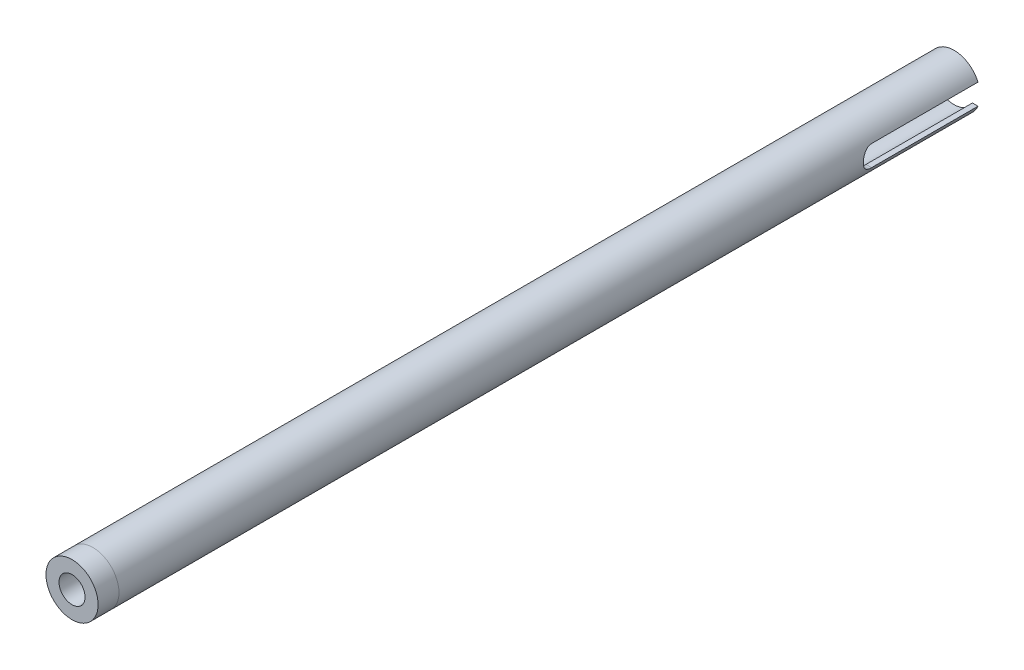
ISO-10303-21;
HEADER;
FILE_DESCRIPTION(('STEP AP214'),'2;1');
FILE_NAME('part.step','',(''),(''),'','','');
FILE_SCHEMA(('AUTOMOTIVE_DESIGN { 1 0 10303 214 1 1 1 1 }'));
ENDSEC;
DATA;
#1=APPLICATION_CONTEXT('core data for automotive mechanical design processes');
#2=APPLICATION_PROTOCOL_DEFINITION('international standard','automotive_design',2000,#1);
#3=PRODUCT_CONTEXT('',#1,'mechanical');
#4=PRODUCT('Part','Part','',(#3));
#5=PRODUCT_RELATED_PRODUCT_CATEGORY('part','',(#4));
#6=PRODUCT_DEFINITION_FORMATION('','',#4);
#7=PRODUCT_DEFINITION_CONTEXT('part definition',#1,'design');
#8=PRODUCT_DEFINITION('design','',#6,#7);
#9=PRODUCT_DEFINITION_SHAPE('','',#8);
#10=(LENGTH_UNIT() NAMED_UNIT(*) SI_UNIT(.MILLI.,.METRE.));
#11=(NAMED_UNIT(*) PLANE_ANGLE_UNIT() SI_UNIT($,.RADIAN.));
#12=(NAMED_UNIT(*) SI_UNIT($,.STERADIAN.) SOLID_ANGLE_UNIT());
#13=UNCERTAINTY_MEASURE_WITH_UNIT(LENGTH_MEASURE(1.E-05),#10,'distance_accuracy_value','');
#14=(GEOMETRIC_REPRESENTATION_CONTEXT(3) GLOBAL_UNCERTAINTY_ASSIGNED_CONTEXT((#13)) GLOBAL_UNIT_ASSIGNED_CONTEXT((#10,
#11,#12)) REPRESENTATION_CONTEXT('',''));
#15=CARTESIAN_POINT('',(0.,0.,0.));
#16=DIRECTION('',(0.,0.,1.));
#17=DIRECTION('',(1.,0.,0.));
#18=AXIS2_PLACEMENT_3D('',#15,#16,#17);
#19=CARTESIAN_POINT('',(0.,0.,-268.498498783583));
#20=DIRECTION('',(0.,0.,1.));
#21=DIRECTION('',(1.,0.,0.));
#22=AXIS2_PLACEMENT_3D('',#19,#20,#21);
#23=CYLINDRICAL_SURFACE('',#22,7.9375);
#24=CARTESIAN_POINT('',(0.,0.,-6.35));
#25=DIRECTION('',(0.,0.,1.));
#26=DIRECTION('',(1.,0.,0.));
#27=AXIS2_PLACEMENT_3D('',#24,#25,#26);
#28=CIRCLE('',#27,7.9375);
#29=CARTESIAN_POINT('',(7.9375,0.,-6.35));
#30=VERTEX_POINT('',#29);
#31=EDGE_CURVE('E167',#30,#30,#28,.T.);
#32=ORIENTED_EDGE('',*,*,#31,.F.);
#33=EDGE_LOOP('',(#32));
#34=FACE_BOUND('',#33,.T.);
#35=CARTESIAN_POINT('',(-7.2748389157424,3.175,-236.113498783583));
#36=CARTESIAN_POINT('',(-7.27482137043434,3.17501267173453,-236.028078668101));
#37=CARTESIAN_POINT('',(-7.27634297592672,3.17155313247793,-235.942668138538));
#38=CARTESIAN_POINT('',(-7.28233338484875,3.15778866907725,-235.77253613421));
#39=CARTESIAN_POINT('',(-7.28680106535325,3.14748635311323,-235.687814409351));
#40=CARTESIAN_POINT('',(-7.29852916312671,3.12019002880163,-235.520000709542));
#41=CARTESIAN_POINT('',(-7.30577831906487,3.10322299732752,-235.436903564783));
#42=CARTESIAN_POINT('',(-7.32282161153745,3.06278779397034,-235.272592462757));
#43=CARTESIAN_POINT('',(-7.33261590324725,3.03931922568673,-235.191378620644));
#44=CARTESIAN_POINT('',(-7.36535331460444,2.9595292434296,-234.951553798061));
#45=CARTESIAN_POINT('',(-7.3916759567784,2.89376893609236,-234.796428869258));
#46=CARTESIAN_POINT('',(-7.45033259991548,2.73920602658921,-234.499341442546));
#47=CARTESIAN_POINT('',(-7.48267254395243,2.65038060922871,-234.357392167329));
#48=CARTESIAN_POINT('',(-7.55175295441386,2.44684429809695,-234.082671397809));
#49=CARTESIAN_POINT('',(-7.58863404630154,2.33103943595689,-233.950744013297));
#50=CARTESIAN_POINT('',(-7.66147718953598,2.07914562663536,-233.707581129665));
#51=CARTESIAN_POINT('',(-7.69743902899202,1.94305205135847,-233.596350364738));
#52=CARTESIAN_POINT('',(-7.76611692840652,1.64778282664418,-233.393429165242));
#53=CARTESIAN_POINT('',(-7.79864638434713,1.48790317306355,-233.302694753838));
#54=CARTESIAN_POINT('',(-7.85502980346525,1.15369615984562,-233.149837200421));
#55=CARTESIAN_POINT('',(-7.87889360585224,0.979385463602713,-233.087681587803));
#56=CARTESIAN_POINT('',(-7.91022225039827,0.670405323433344,-233.007169944147));
#57=CARTESIAN_POINT('',(-7.92038443902171,0.537888188660429,-232.981492020738));
#58=CARTESIAN_POINT('',(-7.93061686811603,0.337231082382099,-232.955736937656));
#59=CARTESIAN_POINT('',(-7.93319257341971,0.269991647180292,-232.949278840376));
#60=CARTESIAN_POINT('',(-7.93663621925193,0.135173873369592,-232.940657822624));
#61=CARTESIAN_POINT('',(-7.93750363389236,0.067595436817584,-232.938496224806));
#62=CARTESIAN_POINT('',(-7.9375,0.,-232.938498783583));
#63=B_SPLINE_CURVE_WITH_KNOTS('',3,(#35,#36,#37,#38,#39,#40,#41,#42,#43,#44,#45,#46,#47,#48,#49,
#50,#51,#52,#53,#54,#55,#56,#57,#58,#59,#60,#61,#62),.UNSPECIFIED.,.F.,.F.,(4,2,2,2,2,2,2,2,2,2,
2,2,2,4),(0.,0.25616079739664,0.512224013007086,0.767261264672294,1.02231406945474,
1.53142416248601,2.041039780479,2.57679273649399,3.11266809162684,3.66991136029743,
4.22651992730647,4.63134321412667,4.83399375866621,5.03670667834028),.UNSPECIFIED.);
#64=CARTESIAN_POINT('',(-7.2748389157424,3.175,-236.113498783583));
#65=VERTEX_POINT('',#64);
#66=CARTESIAN_POINT('',(-7.9375,0.,-232.938498783583));
#67=VERTEX_POINT('',#66);
#68=EDGE_CURVE('E194',#65,#67,#63,.T.);
#69=ORIENTED_EDGE('',*,*,#68,.T.);
#70=CARTESIAN_POINT('',(-7.9375,0.,-232.938498783583));
#71=CARTESIAN_POINT('',(-7.93751279435796,-0.0856973243893161,-232.938486753414));
#72=CARTESIAN_POINT('',(-7.93611246860092,-0.171386675169289,-232.941968120886));
#73=CARTESIAN_POINT('',(-7.93058107051394,-0.342092796869087,-232.955824216221));
#74=CARTESIAN_POINT('',(-7.92645080745519,-0.427109759557717,-232.966196901204));
#75=CARTESIAN_POINT('',(-7.91557399086504,-0.595570690948318,-232.993694095271));
#76=CARTESIAN_POINT('',(-7.90883664469869,-0.679019123580009,-233.010794846544));
#77=CARTESIAN_POINT('',(-7.89293284658536,-0.844038966454647,-233.051562094018));
#78=CARTESIAN_POINT('',(-7.88376629739099,-0.925610301410308,-233.075228853074));
#79=CARTESIAN_POINT('',(-7.8529700783248,-1.16656173687589,-233.155736508773));
#80=CARTESIAN_POINT('',(-7.82802544143957,-1.32244720282991,-233.22212914165));
#81=CARTESIAN_POINT('',(-7.77174407779742,-1.6208190257289,-233.378174545643));
#82=CARTESIAN_POINT('',(-7.74040257287306,-1.76329524966532,-233.467844717706));
#83=CARTESIAN_POINT('',(-7.67287736621953,-2.03755465224645,-233.672298325221));
#84=CARTESIAN_POINT('',(-7.63654472176442,-2.16862853615059,-233.787985181953));
#85=CARTESIAN_POINT('',(-7.56380976030912,-2.41011022612819,-234.039279283662));
#86=CARTESIAN_POINT('',(-7.52740741976911,-2.52050895891189,-234.174895228144));
#87=CARTESIAN_POINT('',(-7.45683282624283,-2.72240939900244,-234.469593723011));
#88=CARTESIAN_POINT('',(-7.42283467350379,-2.81283701743192,-234.629457712926));
#89=CARTESIAN_POINT('',(-7.36333622196319,-2.9651189416839,-234.963583677722));
#90=CARTESIAN_POINT('',(-7.33782422493328,-3.02701262758154,-235.137825415482));
#91=CARTESIAN_POINT('',(-7.30424985403508,-3.10695047193343,-235.446129140133));
#92=CARTESIAN_POINT('',(-7.29331360019112,-3.13238569878911,-235.577987901019));
#93=CARTESIAN_POINT('',(-7.2822797767429,-3.15790858319002,-235.777704782713));
#94=CARTESIAN_POINT('',(-7.27949685702346,-3.16431127275807,-235.844653073473));
#95=CARTESIAN_POINT('',(-7.27577355567174,-3.17285909036155,-235.978894631339));
#96=CARTESIAN_POINT('',(-7.27483380475762,-3.17500276099679,-236.046188008637));
#97=CARTESIAN_POINT('',(-7.2748389157424,-3.175,-236.113498783583));
#98=B_SPLINE_CURVE_WITH_KNOTS('',3,(#70,#71,#72,#73,#74,#75,#76,#77,#78,#79,#80,#81,#82,#83,#84,
#85,#86,#87,#88,#89,#90,#91,#92,#93,#94,#95,#96,#97),.UNSPECIFIED.,.F.,.F.,(4,2,2,2,2,2,2,2,2,2,
2,2,2,4),(0.,0.256996432008006,0.513916713336977,0.769937797705395,1.02596913282158,
1.53722547809955,2.04886511530061,2.58219314099272,3.115754672018,3.67332953074265,
4.23013255190376,4.63306130520187,4.83485003827449,5.03670780985621),.UNSPECIFIED.);
#99=CARTESIAN_POINT('',(-7.2748389157424,-3.175,-236.113498783583));
#100=VERTEX_POINT('',#99);
#101=EDGE_CURVE('E146',#67,#100,#98,.T.);
#102=ORIENTED_EDGE('',*,*,#101,.T.);
#103=DIRECTION('',(0.,0.,-1.));
#104=VECTOR('',#103,1.);
#105=CARTESIAN_POINT('',(-7.2748389157424,-3.175,-232.938498783583));
#106=LINE('',#105,#104);
#107=CARTESIAN_POINT('',(-7.2748389157424,-3.175,-268.498498783583));
#108=VERTEX_POINT('',#107);
#109=EDGE_CURVE('E141',#100,#108,#106,.T.);
#110=ORIENTED_EDGE('',*,*,#109,.T.);
#111=CARTESIAN_POINT('',(0.,0.,-268.498498783583));
#112=DIRECTION('',(0.,0.,1.));
#113=DIRECTION('',(1.,0.,0.));
#114=AXIS2_PLACEMENT_3D('',#111,#112,#113);
#115=CIRCLE('',#114,7.9375);
#116=CARTESIAN_POINT('',(7.2748389157424,-3.175,-268.498498783583));
#117=VERTEX_POINT('',#116);
#118=EDGE_CURVE('E144',#108,#117,#115,.T.);
#119=ORIENTED_EDGE('',*,*,#118,.T.);
#120=DIRECTION('',(0.,0.,-1.));
#121=VECTOR('',#120,1.);
#122=CARTESIAN_POINT('',(7.2748389157424,-3.175,-232.938498783583));
#123=LINE('',#122,#121);
#124=CARTESIAN_POINT('',(7.2748389157424,-3.175,-236.113498783583));
#125=VERTEX_POINT('',#124);
#126=EDGE_CURVE('E427',#125,#117,#123,.T.);
#127=ORIENTED_EDGE('',*,*,#126,.F.);
#128=CARTESIAN_POINT('',(7.2748389157424,-3.175,-236.113498783583));
#129=CARTESIAN_POINT('',(7.27482137043434,-3.17501267173453,-236.028078668101));
#130=CARTESIAN_POINT('',(7.27634297592672,-3.17155313247793,-235.942668138538));
#131=CARTESIAN_POINT('',(7.28233338484875,-3.15778866907725,-235.77253613421));
#132=CARTESIAN_POINT('',(7.28680106535325,-3.14748635311323,-235.687814409351));
#133=CARTESIAN_POINT('',(7.29852916312671,-3.12019002880163,-235.520000709542));
#134=CARTESIAN_POINT('',(7.30577831906487,-3.10322299732752,-235.436903564783));
#135=CARTESIAN_POINT('',(7.32282161153745,-3.06278779397034,-235.272592462757));
#136=CARTESIAN_POINT('',(7.33261590324725,-3.03931922568673,-235.191378620644));
#137=CARTESIAN_POINT('',(7.36535331460444,-2.9595292434296,-234.951553798061));
#138=CARTESIAN_POINT('',(7.3916759567784,-2.89376893609236,-234.796428869258));
#139=CARTESIAN_POINT('',(7.45033259991548,-2.73920602658921,-234.499341442546));
#140=CARTESIAN_POINT('',(7.48267254395243,-2.65038060922871,-234.357392167329));
#141=CARTESIAN_POINT('',(7.55175295441386,-2.44684429809695,-234.082671397809));
#142=CARTESIAN_POINT('',(7.58863404630154,-2.33103943595689,-233.950744013297));
#143=CARTESIAN_POINT('',(7.66147718953598,-2.07914562663536,-233.707581129665));
#144=CARTESIAN_POINT('',(7.69743902899202,-1.94305205135847,-233.596350364738));
#145=CARTESIAN_POINT('',(7.76611692840652,-1.64778282664418,-233.393429165242));
#146=CARTESIAN_POINT('',(7.79864638434713,-1.48790317306355,-233.302694753838));
#147=CARTESIAN_POINT('',(7.85502980346525,-1.15369615984562,-233.149837200421));
#148=CARTESIAN_POINT('',(7.87889360585224,-0.979385463602713,-233.087681587803));
#149=CARTESIAN_POINT('',(7.91022225039827,-0.670405323433344,-233.007169944147));
#150=CARTESIAN_POINT('',(7.92038443902171,-0.537888188660429,-232.981492020738));
#151=CARTESIAN_POINT('',(7.93061686811603,-0.337231082382099,-232.955736937656));
#152=CARTESIAN_POINT('',(7.93319257341971,-0.269991647180292,-232.949278840376));
#153=CARTESIAN_POINT('',(7.93663621925193,-0.135173873369592,-232.940657822624));
#154=CARTESIAN_POINT('',(7.93750363389236,-0.067595436817584,-232.938496224806));
#155=CARTESIAN_POINT('',(7.9375,0.,-232.938498783583));
#156=B_SPLINE_CURVE_WITH_KNOTS('',3,(#128,#129,#130,#131,#132,#133,#134,#135,#136,#137,#138,
#139,#140,#141,#142,#143,#144,#145,#146,#147,#148,#149,#150,#151,#152,#153,#154,#155),
.UNSPECIFIED.,.F.,.F.,(4,2,2,2,2,2,2,2,2,2,2,2,2,4),(0.,0.25616079739664,0.512224013007086,
0.767261264672294,1.02231406945474,1.53142416248601,2.041039780479,2.57679273649399,
3.11266809162684,3.66991136029743,4.22651992730647,4.63134321412667,4.83399375866621,
5.03670667834028),.UNSPECIFIED.);
#157=CARTESIAN_POINT('',(7.9375,0.,-232.938498783583));
#158=VERTEX_POINT('',#157);
#159=EDGE_CURVE('E87',#125,#158,#156,.T.);
#160=ORIENTED_EDGE('',*,*,#159,.T.);
#161=CARTESIAN_POINT('',(7.9375,0.,-232.938498783583));
#162=CARTESIAN_POINT('',(7.93751279435796,0.0856973243893161,-232.938486753414));
#163=CARTESIAN_POINT('',(7.93611246860092,0.171386675169289,-232.941968120886));
#164=CARTESIAN_POINT('',(7.93058107051394,0.342092796869087,-232.955824216221));
#165=CARTESIAN_POINT('',(7.92645080745519,0.427109759557717,-232.966196901204));
#166=CARTESIAN_POINT('',(7.91557399086504,0.595570690948318,-232.993694095271));
#167=CARTESIAN_POINT('',(7.90883664469869,0.679019123580009,-233.010794846544));
#168=CARTESIAN_POINT('',(7.89293284658536,0.844038966454647,-233.051562094018));
#169=CARTESIAN_POINT('',(7.88376629739099,0.925610301410308,-233.075228853074));
#170=CARTESIAN_POINT('',(7.8529700783248,1.16656173687589,-233.155736508773));
#171=CARTESIAN_POINT('',(7.82802544143957,1.32244720282991,-233.22212914165));
#172=CARTESIAN_POINT('',(7.77174407779742,1.6208190257289,-233.378174545643));
#173=CARTESIAN_POINT('',(7.74040257287306,1.76329524966532,-233.467844717706));
#174=CARTESIAN_POINT('',(7.67287736621953,2.03755465224645,-233.672298325221));
#175=CARTESIAN_POINT('',(7.63654472176442,2.16862853615059,-233.787985181953));
#176=CARTESIAN_POINT('',(7.56380976030912,2.41011022612819,-234.039279283662));
#177=CARTESIAN_POINT('',(7.52740741976911,2.52050895891189,-234.174895228144));
#178=CARTESIAN_POINT('',(7.45683282624283,2.72240939900244,-234.469593723011));
#179=CARTESIAN_POINT('',(7.42283467350379,2.81283701743192,-234.629457712926));
#180=CARTESIAN_POINT('',(7.36333622196319,2.9651189416839,-234.963583677722));
#181=CARTESIAN_POINT('',(7.33782422493328,3.02701262758154,-235.137825415482));
#182=CARTESIAN_POINT('',(7.30424985403508,3.10695047193343,-235.446129140133));
#183=CARTESIAN_POINT('',(7.29331360019112,3.13238569878911,-235.577987901019));
#184=CARTESIAN_POINT('',(7.2822797767429,3.15790858319002,-235.777704782713));
#185=CARTESIAN_POINT('',(7.27949685702346,3.16431127275807,-235.844653073473));
#186=CARTESIAN_POINT('',(7.27577355567174,3.17285909036155,-235.978894631339));
#187=CARTESIAN_POINT('',(7.27483380475762,3.17500276099679,-236.046188008637));
#188=CARTESIAN_POINT('',(7.2748389157424,3.175,-236.113498783583));
#189=B_SPLINE_CURVE_WITH_KNOTS('',3,(#161,#162,#163,#164,#165,#166,#167,#168,#169,#170,#171,
#172,#173,#174,#175,#176,#177,#178,#179,#180,#181,#182,#183,#184,#185,#186,#187,#188),
.UNSPECIFIED.,.F.,.F.,(4,2,2,2,2,2,2,2,2,2,2,2,2,4),(0.,0.256996432008006,0.513916713336977,
0.769937797705395,1.02596913282158,1.53722547809955,2.04886511530061,2.58219314099272,
3.115754672018,3.67332953074265,4.23013255190376,4.63306130520187,4.83485003827449,
5.03670780985621),.UNSPECIFIED.);
#190=CARTESIAN_POINT('',(7.2748389157424,3.175,-236.113498783583));
#191=VERTEX_POINT('',#190);
#192=EDGE_CURVE('E73',#158,#191,#189,.T.);
#193=ORIENTED_EDGE('',*,*,#192,.T.);
#194=DIRECTION('',(0.,0.,-1.));
#195=VECTOR('',#194,1.);
#196=CARTESIAN_POINT('',(7.2748389157424,3.175,-232.938498783583));
#197=LINE('',#196,#195);
#198=CARTESIAN_POINT('',(7.2748389157424,3.175,-268.498498783583));
#199=VERTEX_POINT('',#198);
#200=EDGE_CURVE('E160',#191,#199,#197,.T.);
#201=ORIENTED_EDGE('',*,*,#200,.T.);
#202=CARTESIAN_POINT('',(-7.2748389157424,3.175,-268.498498783583));
#203=VERTEX_POINT('',#202);
#204=EDGE_CURVE('E166',#199,#203,#115,.T.);
#205=ORIENTED_EDGE('',*,*,#204,.T.);
#206=DIRECTION('',(0.,0.,-1.));
#207=VECTOR('',#206,1.);
#208=CARTESIAN_POINT('',(-7.2748389157424,3.175,-232.938498783583));
#209=LINE('',#208,#207);
#210=EDGE_CURVE('E420',#65,#203,#209,.T.);
#211=ORIENTED_EDGE('',*,*,#210,.F.);
#212=EDGE_LOOP('',(#69,#102,#110,#119,#127,#160,#193,#201,#205,#211));
#213=FACE_BOUND('',#212,.T.);
#214=ADVANCED_FACE('F63',(#34,#213),#23,.T.);
#215=CARTESIAN_POINT('',(0.,0.,-268.498498783583));
#216=DIRECTION('',(0.,0.,1.));
#217=DIRECTION('',(1.,0.,0.));
#218=AXIS2_PLACEMENT_3D('',#215,#216,#217);
#219=PLANE('',#218);
#220=DIRECTION('',(1.,0.,0.));
#221=VECTOR('',#220,1.);
#222=CARTESIAN_POINT('',(0.,-3.175,-268.498498783583));
#223=LINE('',#222,#221);
#224=CARTESIAN_POINT('',(-5.57246419907746,-3.175,-268.498498783583));
#225=VERTEX_POINT('',#224);
#226=EDGE_CURVE('E153',#108,#225,#223,.T.);
#227=ORIENTED_EDGE('',*,*,#226,.T.);
#228=CARTESIAN_POINT('',(0.,0.,-268.498498783583));
#229=DIRECTION('',(0.,0.,1.));
#230=DIRECTION('',(1.,0.,0.));
#231=AXIS2_PLACEMENT_3D('',#228,#229,#230);
#232=CIRCLE('',#231,6.4135);
#233=CARTESIAN_POINT('',(5.57246419907746,-3.175,-268.498498783583));
#234=VERTEX_POINT('',#233);
#235=EDGE_CURVE('E275',#225,#234,#232,.T.);
#236=ORIENTED_EDGE('',*,*,#235,.T.);
#237=DIRECTION('',(1.,0.,0.));
#238=VECTOR('',#237,1.);
#239=CARTESIAN_POINT('',(0.,-3.175,-268.498498783583));
#240=LINE('',#239,#238);
#241=EDGE_CURVE('E165',#234,#117,#240,.T.);
#242=ORIENTED_EDGE('',*,*,#241,.T.);
#243=ORIENTED_EDGE('',*,*,#118,.F.);
#244=EDGE_LOOP('',(#227,#236,#242,#243));
#245=FACE_BOUND('',#244,.T.);
#246=ADVANCED_FACE('F163',(#245),#219,.F.);
#247=CARTESIAN_POINT('',(0.,0.,-268.498498783583));
#248=DIRECTION('',(0.,0.,1.));
#249=DIRECTION('',(1.,0.,0.));
#250=AXIS2_PLACEMENT_3D('',#247,#248,#249);
#251=CYLINDRICAL_SURFACE('',#250,6.4135);
#252=CARTESIAN_POINT('',(0.,0.,-6.35));
#253=DIRECTION('',(0.,0.,1.));
#254=DIRECTION('',(1.,0.,0.));
#255=AXIS2_PLACEMENT_3D('',#252,#253,#254);
#256=CIRCLE('',#255,6.4135);
#257=CARTESIAN_POINT('',(6.4135,0.,-6.35));
#258=VERTEX_POINT('',#257);
#259=EDGE_CURVE('E149',#258,#258,#256,.T.);
#260=ORIENTED_EDGE('',*,*,#259,.T.);
#261=EDGE_LOOP('',(#260));
#262=FACE_BOUND('',#261,.T.);
#263=DIRECTION('',(0.,0.,-1.));
#264=VECTOR('',#263,1.);
#265=CARTESIAN_POINT('',(-5.57246419907746,-3.175,-232.938498783583));
#266=LINE('',#265,#264);
#267=CARTESIAN_POINT('',(-5.57246419907746,-3.175,-236.113498783583));
#268=VERTEX_POINT('',#267);
#269=EDGE_CURVE('E150',#268,#225,#266,.T.);
#270=ORIENTED_EDGE('',*,*,#269,.F.);
#271=CARTESIAN_POINT('',(-5.57246419907746,-3.175,-236.113498783583));
#272=CARTESIAN_POINT('',(-5.57244013006406,-3.17501485930532,-236.030219670545));
#273=CARTESIAN_POINT('',(-5.57433046393328,-3.17172393593588,-235.946953903674));
#274=CARTESIAN_POINT('',(-5.58175879139226,-3.1586474174694,-235.781146318862));
#275=CARTESIAN_POINT('',(-5.58729459414878,-3.14886572313218,-235.698604096261));
#276=CARTESIAN_POINT('',(-5.60179156831921,-3.12299843383607,-235.535307289532));
#277=CARTESIAN_POINT('',(-5.61073298145,-3.10694918790096,-235.454545184618));
#278=CARTESIAN_POINT('',(-5.63171276239417,-3.068756659135,-235.294901269117));
#279=CARTESIAN_POINT('',(-5.64375147558632,-3.04661269666536,-235.216019669297));
#280=CARTESIAN_POINT('',(-5.6838799338154,-2.97148657354666,-234.983286494299));
#281=CARTESIAN_POINT('',(-5.71602843451584,-2.90973243042151,-234.83286599706));
#282=CARTESIAN_POINT('',(-5.78746445334562,-2.76491119647659,-234.544408780232));
#283=CARTESIAN_POINT('',(-5.82676307252431,-2.68181088046089,-234.406391822866));
#284=CARTESIAN_POINT('',(-5.91189137020973,-2.48887418737119,-234.134594738838));
#285=CARTESIAN_POINT('',(-5.95799203211626,-2.37743022169018,-234.002037936386));
#286=CARTESIAN_POINT('',(-6.04933625068999,-2.13433179626949,-233.756570267313));
#287=CARTESIAN_POINT('',(-6.09457954365872,-2.00267122837297,-233.643665360301));
#288=CARTESIAN_POINT('',(-6.18270630442022,-1.71220053093683,-233.433346067848));
#289=CARTESIAN_POINT('',(-6.22523407848511,-1.55216870534976,-233.337456317417));
#290=CARTESIAN_POINT('',(-6.29953728626817,-1.21586879246633,-233.1746074211));
#291=CARTESIAN_POINT('',(-6.33132906884324,-1.03962591706377,-233.107604243057));
#292=CARTESIAN_POINT('',(-6.37455801221378,-0.71941894247625,-233.017732410727));
#293=CARTESIAN_POINT('',(-6.38903678436651,-0.577736145507954,-232.988159696362));
#294=CARTESIAN_POINT('',(-6.40364692368403,-0.362616983152033,-232.958438622048));
#295=CARTESIAN_POINT('',(-6.40733246196224,-0.290370591494073,-232.95097110941));
#296=CARTESIAN_POINT('',(-6.41226237468065,-0.145424356491902,-232.940998220472));
#297=CARTESIAN_POINT('',(-6.41350576158006,-0.0727243416303688,-232.938494851535));
#298=CARTESIAN_POINT('',(-6.4135,0.,-232.938498783583));
#299=B_SPLINE_CURVE_WITH_KNOTS('',3,(#271,#272,#273,#274,#275,#276,#277,#278,#279,#280,#281,
#282,#283,#284,#285,#286,#287,#288,#289,#290,#291,#292,#293,#294,#295,#296,#297,#298),
.UNSPECIFIED.,.F.,.F.,(4,2,2,2,2,2,2,2,2,2,2,2,2,4),(0.,0.249729002226553,0.499308060527525,
0.74746066754666,0.995640957972498,1.49055300136658,1.98624009021396,2.52160227908797,
3.05712653941521,3.62817923327587,4.19835836008503,4.63305000595098,4.85103401853338,
5.06910615989468),.UNSPECIFIED.);
#300=CARTESIAN_POINT('',(-6.4135,0.,-232.938498783583));
#301=VERTEX_POINT('',#300);
#302=EDGE_CURVE('E221',#268,#301,#299,.T.);
#303=ORIENTED_EDGE('',*,*,#302,.T.);
#304=CARTESIAN_POINT('',(-6.4135,0.,-232.938498783583));
#305=CARTESIAN_POINT('',(-6.41351478956106,0.0839162873638162,-232.938485383687));
#306=CARTESIAN_POINT('',(-6.41185341043851,0.167823114288179,-232.941825309734));
#307=CARTESIAN_POINT('',(-6.40528923860734,0.334952536326369,-232.955107750339));
#308=CARTESIAN_POINT('',(-6.40038773102953,0.418175389480092,-232.96504764716));
#309=CARTESIAN_POINT('',(-6.38748331817869,0.582965498785221,-232.991366451678));
#310=CARTESIAN_POINT('',(-6.37949454331383,0.664538541389254,-233.007716027166));
#311=CARTESIAN_POINT('',(-6.36062930478242,0.825821595252371,-233.046654330759));
#312=CARTESIAN_POINT('',(-6.34975266552956,0.905531492908815,-233.06924343824));
#313=CARTESIAN_POINT('',(-6.31319792977547,1.14087800407252,-233.145980001));
#314=CARTESIAN_POINT('',(-6.28356695572382,1.29306927815056,-233.209151649188));
#315=CARTESIAN_POINT('',(-6.216480326228,1.58455945770356,-233.357302391168));
#316=CARTESIAN_POINT('',(-6.17901685649498,1.72384528592311,-233.442303282947));
#317=CARTESIAN_POINT('',(-6.09713913910646,1.99475482128858,-233.637403421199));
#318=CARTESIAN_POINT('',(-6.05244508581476,2.12544046453043,-233.748688297937));
#319=CARTESIAN_POINT('',(-5.96206469267669,2.36716277188881,-233.990657744102));
#320=CARTESIAN_POINT('',(-5.91637760323869,2.47818397002904,-234.121357435942));
#321=CARTESIAN_POINT('',(-5.82517699615971,2.68591268931948,-234.410403264894));
#322=CARTESIAN_POINT('',(-5.77994318763785,2.78087960507694,-234.570098459474));
#323=CARTESIAN_POINT('',(-5.69959190124919,2.94207442790849,-234.905481736656));
#324=CARTESIAN_POINT('',(-5.66445328320705,3.00836254036258,-235.081135369828));
#325=CARTESIAN_POINT('',(-5.61637168534323,3.09697219420915,-235.399586744221));
#326=CARTESIAN_POINT('',(-5.60011055849822,3.1260622343607,-235.540001346881));
#327=CARTESIAN_POINT('',(-5.58363385282995,3.15533369889112,-235.753378225123));
#328=CARTESIAN_POINT('',(-5.57946041232981,3.16269716900745,-235.825109950005));
#329=CARTESIAN_POINT('',(-5.57386984218861,3.17253394278506,-235.969051890048));
#330=CARTESIAN_POINT('',(-5.57245416126573,3.17500467618403,-236.041262336719));
#331=CARTESIAN_POINT('',(-5.57246419907746,3.175,-236.113498783583));
#332=B_SPLINE_CURVE_WITH_KNOTS('',3,(#304,#305,#306,#307,#308,#309,#310,#311,#312,#313,#314,
#315,#316,#317,#318,#319,#320,#321,#322,#323,#324,#325,#326,#327,#328,#329,#330,#331),
.UNSPECIFIED.,.F.,.F.,(4,2,2,2,2,2,2,2,2,2,2,2,2,4),(0.,0.251650249697327,0.503200747298844,
0.753613280993145,1.00404104361823,1.50387930503277,2.00421864304454,2.53410176460239,
3.06439980342594,3.63519589642624,4.20478783377489,4.63602373673191,4.85251353275901,
5.06911702550462),.UNSPECIFIED.);
#333=CARTESIAN_POINT('',(-5.57246419907746,3.175,-236.113498783583));
#334=VERTEX_POINT('',#333);
#335=EDGE_CURVE('E186',#301,#334,#332,.T.);
#336=ORIENTED_EDGE('',*,*,#335,.T.);
#337=DIRECTION('',(0.,0.,-1.));
#338=VECTOR('',#337,1.);
#339=CARTESIAN_POINT('',(-5.57246419907746,3.175,-232.938498783583));
#340=LINE('',#339,#338);
#341=CARTESIAN_POINT('',(-5.57246419907746,3.175,-268.498498783583));
#342=VERTEX_POINT('',#341);
#343=EDGE_CURVE('E417',#334,#342,#340,.T.);
#344=ORIENTED_EDGE('',*,*,#343,.T.);
#345=CARTESIAN_POINT('',(5.57246419907746,3.175,-268.498498783583));
#346=VERTEX_POINT('',#345);
#347=EDGE_CURVE('E172',#346,#342,#232,.T.);
#348=ORIENTED_EDGE('',*,*,#347,.F.);
#349=DIRECTION('',(0.,0.,-1.));
#350=VECTOR('',#349,1.);
#351=CARTESIAN_POINT('',(5.57246419907746,3.175,-232.938498783583));
#352=LINE('',#351,#350);
#353=CARTESIAN_POINT('',(5.57246419907746,3.175,-236.113498783583));
#354=VERTEX_POINT('',#353);
#355=EDGE_CURVE('E269',#354,#346,#352,.T.);
#356=ORIENTED_EDGE('',*,*,#355,.F.);
#357=CARTESIAN_POINT('',(5.57246419907746,3.175,-236.113498783583));
#358=CARTESIAN_POINT('',(5.57244013006406,3.17501485930532,-236.030219670545));
#359=CARTESIAN_POINT('',(5.57433046393328,3.17172393593588,-235.946953903674));
#360=CARTESIAN_POINT('',(5.58175879139226,3.1586474174694,-235.781146318862));
#361=CARTESIAN_POINT('',(5.58729459414878,3.14886572313218,-235.698604096261));
#362=CARTESIAN_POINT('',(5.60179156831921,3.12299843383607,-235.535307289532));
#363=CARTESIAN_POINT('',(5.61073298145,3.10694918790096,-235.454545184618));
#364=CARTESIAN_POINT('',(5.63171276239417,3.068756659135,-235.294901269117));
#365=CARTESIAN_POINT('',(5.64375147558632,3.04661269666536,-235.216019669297));
#366=CARTESIAN_POINT('',(5.6838799338154,2.97148657354666,-234.983286494299));
#367=CARTESIAN_POINT('',(5.71602843451584,2.90973243042151,-234.83286599706));
#368=CARTESIAN_POINT('',(5.78746445334562,2.76491119647659,-234.544408780232));
#369=CARTESIAN_POINT('',(5.82676307252431,2.68181088046089,-234.406391822866));
#370=CARTESIAN_POINT('',(5.91189137020973,2.48887418737119,-234.134594738838));
#371=CARTESIAN_POINT('',(5.95799203211626,2.37743022169018,-234.002037936386));
#372=CARTESIAN_POINT('',(6.04933625068999,2.13433179626949,-233.756570267313));
#373=CARTESIAN_POINT('',(6.09457954365872,2.00267122837297,-233.643665360301));
#374=CARTESIAN_POINT('',(6.18270630442022,1.71220053093683,-233.433346067848));
#375=CARTESIAN_POINT('',(6.22523407848511,1.55216870534976,-233.337456317417));
#376=CARTESIAN_POINT('',(6.29953728626817,1.21586879246633,-233.1746074211));
#377=CARTESIAN_POINT('',(6.33132906884324,1.03962591706377,-233.107604243057));
#378=CARTESIAN_POINT('',(6.37455801221378,0.71941894247625,-233.017732410727));
#379=CARTESIAN_POINT('',(6.38903678436651,0.577736145507954,-232.988159696362));
#380=CARTESIAN_POINT('',(6.40364692368403,0.362616983152033,-232.958438622048));
#381=CARTESIAN_POINT('',(6.40733246196224,0.290370591494073,-232.95097110941));
#382=CARTESIAN_POINT('',(6.41226237468065,0.145424356491902,-232.940998220472));
#383=CARTESIAN_POINT('',(6.41350576158006,0.0727243416303688,-232.938494851535));
#384=CARTESIAN_POINT('',(6.4135,0.,-232.938498783583));
#385=B_SPLINE_CURVE_WITH_KNOTS('',3,(#357,#358,#359,#360,#361,#362,#363,#364,#365,#366,#367,
#368,#369,#370,#371,#372,#373,#374,#375,#376,#377,#378,#379,#380,#381,#382,#383,#384),
.UNSPECIFIED.,.F.,.F.,(4,2,2,2,2,2,2,2,2,2,2,2,2,4),(0.,0.249729002226553,0.499308060527525,
0.74746066754666,0.995640957972498,1.49055300136658,1.98624009021396,2.52160227908797,
3.05712653941521,3.62817923327587,4.19835836008503,4.63305000595098,4.85103401853338,
5.06910615989468),.UNSPECIFIED.);
#386=CARTESIAN_POINT('',(6.4135,0.,-232.938498783583));
#387=VERTEX_POINT('',#386);
#388=EDGE_CURVE('E13',#354,#387,#385,.T.);
#389=ORIENTED_EDGE('',*,*,#388,.T.);
#390=CARTESIAN_POINT('',(6.4135,0.,-232.938498783583));
#391=CARTESIAN_POINT('',(6.41351478956106,-0.0839162873638162,-232.938485383687));
#392=CARTESIAN_POINT('',(6.41185341043851,-0.167823114288179,-232.941825309734));
#393=CARTESIAN_POINT('',(6.40528923860734,-0.334952536326369,-232.955107750339));
#394=CARTESIAN_POINT('',(6.40038773102953,-0.418175389480092,-232.96504764716));
#395=CARTESIAN_POINT('',(6.38748331817869,-0.582965498785221,-232.991366451678));
#396=CARTESIAN_POINT('',(6.37949454331383,-0.664538541389254,-233.007716027166));
#397=CARTESIAN_POINT('',(6.36062930478242,-0.825821595252371,-233.046654330759));
#398=CARTESIAN_POINT('',(6.34975266552956,-0.905531492908815,-233.06924343824));
#399=CARTESIAN_POINT('',(6.31319792977547,-1.14087800407252,-233.145980001));
#400=CARTESIAN_POINT('',(6.28356695572382,-1.29306927815056,-233.209151649188));
#401=CARTESIAN_POINT('',(6.216480326228,-1.58455945770356,-233.357302391168));
#402=CARTESIAN_POINT('',(6.17901685649498,-1.72384528592311,-233.442303282947));
#403=CARTESIAN_POINT('',(6.09713913910646,-1.99475482128858,-233.637403421199));
#404=CARTESIAN_POINT('',(6.05244508581476,-2.12544046453043,-233.748688297937));
#405=CARTESIAN_POINT('',(5.96206469267669,-2.36716277188881,-233.990657744102));
#406=CARTESIAN_POINT('',(5.91637760323869,-2.47818397002904,-234.121357435942));
#407=CARTESIAN_POINT('',(5.82517699615971,-2.68591268931948,-234.410403264894));
#408=CARTESIAN_POINT('',(5.77994318763785,-2.78087960507694,-234.570098459474));
#409=CARTESIAN_POINT('',(5.69959190124919,-2.94207442790849,-234.905481736656));
#410=CARTESIAN_POINT('',(5.66445328320705,-3.00836254036258,-235.081135369828));
#411=CARTESIAN_POINT('',(5.61637168534323,-3.09697219420915,-235.399586744221));
#412=CARTESIAN_POINT('',(5.60011055849822,-3.1260622343607,-235.540001346881));
#413=CARTESIAN_POINT('',(5.58363385282995,-3.15533369889112,-235.753378225123));
#414=CARTESIAN_POINT('',(5.57946041232981,-3.16269716900745,-235.825109950005));
#415=CARTESIAN_POINT('',(5.57386984218861,-3.17253394278506,-235.969051890048));
#416=CARTESIAN_POINT('',(5.57245416126573,-3.17500467618403,-236.041262336719));
#417=CARTESIAN_POINT('',(5.57246419907746,-3.175,-236.113498783583));
#418=B_SPLINE_CURVE_WITH_KNOTS('',3,(#390,#391,#392,#393,#394,#395,#396,#397,#398,#399,#400,
#401,#402,#403,#404,#405,#406,#407,#408,#409,#410,#411,#412,#413,#414,#415,#416,#417),
.UNSPECIFIED.,.F.,.F.,(4,2,2,2,2,2,2,2,2,2,2,2,2,4),(0.,0.251650249697327,0.503200747298844,
0.753613280993145,1.00404104361823,1.50387930503277,2.00421864304454,2.53410176460239,
3.06439980342594,3.63519589642624,4.20478783377489,4.63602373673191,4.85251353275901,
5.06911702550462),.UNSPECIFIED.);
#419=CARTESIAN_POINT('',(5.57246419907746,-3.175,-236.113498783583));
#420=VERTEX_POINT('',#419);
#421=EDGE_CURVE('E237',#387,#420,#418,.T.);
#422=ORIENTED_EDGE('',*,*,#421,.T.);
#423=DIRECTION('',(0.,0.,-1.));
#424=VECTOR('',#423,1.);
#425=CARTESIAN_POINT('',(5.57246419907746,-3.175,-232.938498783583));
#426=LINE('',#425,#424);
#427=EDGE_CURVE('E271',#420,#234,#426,.T.);
#428=ORIENTED_EDGE('',*,*,#427,.T.);
#429=ORIENTED_EDGE('',*,*,#235,.F.);
#430=EDGE_LOOP('',(#270,#303,#336,#344,#348,#356,#389,#422,#428,#429));
#431=FACE_BOUND('',#430,.T.);
#432=ADVANCED_FACE('F201',(#262,#431),#251,.F.);
#433=ORIENTED_EDGE('',*,*,#347,.T.);
#434=DIRECTION('',(1.,0.,0.));
#435=VECTOR('',#434,1.);
#436=CARTESIAN_POINT('',(0.,3.175,-268.498498783583));
#437=LINE('',#436,#435);
#438=EDGE_CURVE('E159',#203,#342,#437,.T.);
#439=ORIENTED_EDGE('',*,*,#438,.F.);
#440=ORIENTED_EDGE('',*,*,#204,.F.);
#441=DIRECTION('',(1.,0.,0.));
#442=VECTOR('',#441,1.);
#443=CARTESIAN_POINT('',(0.,3.175,-268.498498783583));
#444=LINE('',#443,#442);
#445=EDGE_CURVE('E253',#346,#199,#444,.T.);
#446=ORIENTED_EDGE('',*,*,#445,.F.);
#447=EDGE_LOOP('',(#433,#439,#440,#446));
#448=FACE_BOUND('',#447,.T.);
#449=ADVANCED_FACE('F286',(#448),#219,.F.);
#450=CARTESIAN_POINT('',(0.,0.,-6.35));
#451=DIRECTION('',(0.,0.,1.));
#452=DIRECTION('',(1.,0.,0.));
#453=AXIS2_PLACEMENT_3D('',#450,#451,#452);
#454=PLANE('',#453);
#455=ORIENTED_EDGE('',*,*,#259,.F.);
#456=EDGE_LOOP('',(#455));
#457=FACE_BOUND('',#456,.T.);
#458=ORIENTED_EDGE('',*,*,#31,.T.);
#459=EDGE_LOOP('',(#458));
#460=FACE_BOUND('',#459,.T.);
#461=ADVANCED_FACE('F283',(#457,#460),#454,.T.);
#462=CARTESIAN_POINT('',(0.,3.175,-232.938498783583));
#463=DIRECTION('',(0.,1.,0.));
#464=DIRECTION('',(0.,0.,1.));
#465=AXIS2_PLACEMENT_3D('',#462,#463,#464);
#466=PLANE('',#465);
#467=ORIENTED_EDGE('',*,*,#200,.F.);
#468=DIRECTION('',(1.,0.,0.));
#469=VECTOR('',#468,1.);
#470=CARTESIAN_POINT('',(5.57246419907746,3.175,-236.113498783583));
#471=LINE('',#470,#469);
#472=EDGE_CURVE('E184',#191,#354,#471,.F.);
#473=ORIENTED_EDGE('',*,*,#472,.T.);
#474=ORIENTED_EDGE('',*,*,#355,.T.);
#475=ORIENTED_EDGE('',*,*,#445,.T.);
#476=EDGE_LOOP('',(#467,#473,#474,#475));
#477=FACE_BOUND('',#476,.T.);
#478=ADVANCED_FACE('F266',(#477),#466,.F.);
#479=CARTESIAN_POINT('',(0.,-3.175,-232.938498783583));
#480=DIRECTION('',(0.,1.,0.));
#481=DIRECTION('',(0.,0.,1.));
#482=AXIS2_PLACEMENT_3D('',#479,#480,#481);
#483=PLANE('',#482);
#484=ORIENTED_EDGE('',*,*,#427,.F.);
#485=DIRECTION('',(1.,0.,0.));
#486=VECTOR('',#485,1.);
#487=CARTESIAN_POINT('',(0.,-3.175,-236.113498783583));
#488=LINE('',#487,#486);
#489=EDGE_CURVE('E181',#420,#125,#488,.T.);
#490=ORIENTED_EDGE('',*,*,#489,.T.);
#491=ORIENTED_EDGE('',*,*,#126,.T.);
#492=ORIENTED_EDGE('',*,*,#241,.F.);
#493=EDGE_LOOP('',(#484,#490,#491,#492));
#494=FACE_BOUND('',#493,.T.);
#495=ADVANCED_FACE('F361',(#494),#483,.T.);
#496=CARTESIAN_POINT('',(0.,-3.175,-232.938498783583));
#497=DIRECTION('',(0.,1.,0.));
#498=DIRECTION('',(0.,0.,1.));
#499=AXIS2_PLACEMENT_3D('',#496,#497,#498);
#500=PLANE('',#499);
#501=ORIENTED_EDGE('',*,*,#109,.F.);
#502=DIRECTION('',(1.,0.,0.));
#503=VECTOR('',#502,1.);
#504=CARTESIAN_POINT('',(0.,-3.175,-236.113498783583));
#505=LINE('',#504,#503);
#506=EDGE_CURVE('E179',#100,#268,#505,.T.);
#507=ORIENTED_EDGE('',*,*,#506,.T.);
#508=ORIENTED_EDGE('',*,*,#269,.T.);
#509=ORIENTED_EDGE('',*,*,#226,.F.);
#510=EDGE_LOOP('',(#501,#507,#508,#509));
#511=FACE_BOUND('',#510,.T.);
#512=ADVANCED_FACE('F154',(#511),#500,.T.);
#513=CARTESIAN_POINT('',(0.,3.175,-232.938498783583));
#514=DIRECTION('',(0.,1.,0.));
#515=DIRECTION('',(0.,0.,1.));
#516=AXIS2_PLACEMENT_3D('',#513,#514,#515);
#517=PLANE('',#516);
#518=ORIENTED_EDGE('',*,*,#343,.F.);
#519=DIRECTION('',(1.,0.,0.));
#520=VECTOR('',#519,1.);
#521=CARTESIAN_POINT('',(-7.2748389157424,3.175,-236.113498783583));
#522=LINE('',#521,#520);
#523=EDGE_CURVE('E170',#334,#65,#522,.F.);
#524=ORIENTED_EDGE('',*,*,#523,.T.);
#525=ORIENTED_EDGE('',*,*,#210,.T.);
#526=ORIENTED_EDGE('',*,*,#438,.T.);
#527=EDGE_LOOP('',(#518,#524,#525,#526));
#528=FACE_BOUND('',#527,.T.);
#529=ADVANCED_FACE('F216',(#528),#517,.F.);
#530=CARTESIAN_POINT('',(0.,0.,-236.113498783583));
#531=DIRECTION('',(1.,0.,0.));
#532=DIRECTION('',(0.,0.,-1.));
#533=AXIS2_PLACEMENT_3D('',#530,#531,#532);
#534=CYLINDRICAL_SURFACE('',#533,3.175);
#535=ORIENTED_EDGE('',*,*,#506,.F.);
#536=ORIENTED_EDGE('',*,*,#101,.F.);
#537=DIRECTION('',(1.,0.,0.));
#538=VECTOR('',#537,1.);
#539=CARTESIAN_POINT('',(0.,0.,-232.938498783583));
#540=LINE('',#539,#538);
#541=EDGE_CURVE('E251',#301,#67,#540,.F.);
#542=ORIENTED_EDGE('',*,*,#541,.F.);
#543=ORIENTED_EDGE('',*,*,#302,.F.);
#544=EDGE_LOOP('',(#535,#536,#542,#543));
#545=FACE_BOUND('',#544,.T.);
#546=ADVANCED_FACE('F209',(#545),#534,.F.);
#547=CARTESIAN_POINT('',(0.,0.,-236.113498783583));
#548=DIRECTION('',(-1.,0.,0.));
#549=DIRECTION('',(0.,0.,1.));
#550=AXIS2_PLACEMENT_3D('',#547,#548,#549);
#551=CYLINDRICAL_SURFACE('',#550,3.175);
#552=ORIENTED_EDGE('',*,*,#68,.F.);
#553=ORIENTED_EDGE('',*,*,#523,.F.);
#554=ORIENTED_EDGE('',*,*,#335,.F.);
#555=ORIENTED_EDGE('',*,*,#541,.T.);
#556=EDGE_LOOP('',(#552,#553,#554,#555));
#557=FACE_BOUND('',#556,.T.);
#558=ADVANCED_FACE('F205',(#557),#551,.F.);
#559=CARTESIAN_POINT('',(0.,0.,-236.113498783583));
#560=DIRECTION('',(-1.,0.,0.));
#561=DIRECTION('',(0.,0.,1.));
#562=AXIS2_PLACEMENT_3D('',#559,#560,#561);
#563=CYLINDRICAL_SURFACE('',#562,3.175);
#564=DIRECTION('',(1.,0.,0.));
#565=VECTOR('',#564,1.);
#566=CARTESIAN_POINT('',(7.2748389157424,0.,-232.938498783583));
#567=LINE('',#566,#565);
#568=EDGE_CURVE('E68',#387,#158,#567,.T.);
#569=ORIENTED_EDGE('',*,*,#568,.F.);
#570=ORIENTED_EDGE('',*,*,#388,.F.);
#571=ORIENTED_EDGE('',*,*,#472,.F.);
#572=ORIENTED_EDGE('',*,*,#192,.F.);
#573=EDGE_LOOP('',(#569,#570,#571,#572));
#574=FACE_BOUND('',#573,.T.);
#575=ADVANCED_FACE('F65',(#574),#563,.F.);
#576=CARTESIAN_POINT('',(0.,0.,-236.113498783583));
#577=DIRECTION('',(1.,0.,0.));
#578=DIRECTION('',(0.,0.,-1.));
#579=AXIS2_PLACEMENT_3D('',#576,#577,#578);
#580=CYLINDRICAL_SURFACE('',#579,3.175);
#581=ORIENTED_EDGE('',*,*,#421,.F.);
#582=ORIENTED_EDGE('',*,*,#568,.T.);
#583=ORIENTED_EDGE('',*,*,#159,.F.);
#584=ORIENTED_EDGE('',*,*,#489,.F.);
#585=EDGE_LOOP('',(#581,#582,#583,#584));
#586=FACE_BOUND('',#585,.T.);
#587=ADVANCED_FACE('F218',(#586),#580,.F.);
#588=CLOSED_SHELL('',(#214,#246,#432,#449,#461,#478,#495,#512,#529,#546,#558,#575,#587));
#589=MANIFOLD_SOLID_BREP('B2',#588);
#590=CARTESIAN_POINT('',(0.,0.,-6.35));
#591=DIRECTION('',(0.,0.,1.));
#592=DIRECTION('',(1.,0.,0.));
#593=AXIS2_PLACEMENT_3D('',#590,#591,#592);
#594=CYLINDRICAL_SURFACE('',#593,7.9375);
#595=CARTESIAN_POINT('',(0.,0.,-6.35));
#596=DIRECTION('',(0.,0.,1.));
#597=DIRECTION('',(1.,0.,0.));
#598=AXIS2_PLACEMENT_3D('',#595,#596,#597);
#599=CIRCLE('',#598,7.9375);
#600=CARTESIAN_POINT('',(7.9375,0.,-6.35));
#601=VERTEX_POINT('',#600);
#602=EDGE_CURVE('E62',#601,#601,#599,.T.);
#603=ORIENTED_EDGE('',*,*,#602,.T.);
#604=EDGE_LOOP('',(#603));
#605=FACE_BOUND('',#604,.T.);
#606=CARTESIAN_POINT('',(0.,0.,0.));
#607=DIRECTION('',(0.,0.,1.));
#608=DIRECTION('',(1.,0.,0.));
#609=AXIS2_PLACEMENT_3D('',#606,#607,#608);
#610=CIRCLE('',#609,7.9375);
#611=CARTESIAN_POINT('',(7.9375,0.,0.));
#612=VERTEX_POINT('',#611);
#613=EDGE_CURVE('E465',#612,#612,#610,.T.);
#614=ORIENTED_EDGE('',*,*,#613,.F.);
#615=EDGE_LOOP('',(#614));
#616=FACE_BOUND('',#615,.T.);
#617=ADVANCED_FACE('F454',(#605,#616),#594,.T.);
#618=CARTESIAN_POINT('',(0.,0.,-6.35));
#619=DIRECTION('',(0.,0.,1.));
#620=DIRECTION('',(1.,0.,0.));
#621=AXIS2_PLACEMENT_3D('',#618,#619,#620);
#622=CYLINDRICAL_SURFACE('',#621,3.96875);
#623=CARTESIAN_POINT('',(0.,0.,0.));
#624=DIRECTION('',(0.,0.,1.));
#625=DIRECTION('',(1.,0.,0.));
#626=AXIS2_PLACEMENT_3D('',#623,#624,#625);
#627=CIRCLE('',#626,3.96875);
#628=CARTESIAN_POINT('',(3.96875,0.,0.));
#629=VERTEX_POINT('',#628);
#630=EDGE_CURVE('E457',#629,#629,#627,.T.);
#631=ORIENTED_EDGE('',*,*,#630,.T.);
#632=EDGE_LOOP('',(#631));
#633=FACE_BOUND('',#632,.T.);
#634=CARTESIAN_POINT('',(0.,0.,-15.875));
#635=DIRECTION('',(0.,0.,1.));
#636=DIRECTION('',(1.,0.,0.));
#637=AXIS2_PLACEMENT_3D('',#634,#635,#636);
#638=CIRCLE('',#637,3.96875);
#639=CARTESIAN_POINT('',(3.96875,0.,-15.875));
#640=VERTEX_POINT('',#639);
#641=EDGE_CURVE('E477',#640,#640,#638,.T.);
#642=ORIENTED_EDGE('',*,*,#641,.F.);
#643=EDGE_LOOP('',(#642));
#644=FACE_BOUND('',#643,.T.);
#645=ADVANCED_FACE('F485',(#633,#644),#622,.F.);
#646=CARTESIAN_POINT('',(0.,0.,-6.35));
#647=DIRECTION('',(0.,0.,1.));
#648=DIRECTION('',(1.,0.,0.));
#649=AXIS2_PLACEMENT_3D('',#646,#647,#648);
#650=PLANE('',#649);
#651=CARTESIAN_POINT('',(0.,0.,-6.35));
#652=DIRECTION('',(0.,0.,1.));
#653=DIRECTION('',(1.,0.,0.));
#654=AXIS2_PLACEMENT_3D('',#651,#652,#653);
#655=CIRCLE('',#654,6.4135);
#656=CARTESIAN_POINT('',(6.4135,0.,-6.35));
#657=VERTEX_POINT('',#656);
#658=EDGE_CURVE('E467',#657,#657,#655,.T.);
#659=ORIENTED_EDGE('',*,*,#658,.T.);
#660=EDGE_LOOP('',(#659));
#661=FACE_BOUND('',#660,.T.);
#662=ORIENTED_EDGE('',*,*,#602,.F.);
#663=EDGE_LOOP('',(#662));
#664=FACE_BOUND('',#663,.T.);
#665=ADVANCED_FACE('F487',(#661,#664),#650,.F.);
#666=CARTESIAN_POINT('',(0.,0.,0.));
#667=DIRECTION('',(0.,0.,1.));
#668=DIRECTION('',(1.,0.,0.));
#669=AXIS2_PLACEMENT_3D('',#666,#667,#668);
#670=PLANE('',#669);
#671=ORIENTED_EDGE('',*,*,#613,.T.);
#672=EDGE_LOOP('',(#671));
#673=FACE_BOUND('',#672,.T.);
#674=ORIENTED_EDGE('',*,*,#630,.F.);
#675=EDGE_LOOP('',(#674));
#676=FACE_BOUND('',#675,.T.);
#677=ADVANCED_FACE('F493',(#673,#676),#670,.T.);
#678=CARTESIAN_POINT('',(0.,0.,-15.875));
#679=DIRECTION('',(0.,0.,1.));
#680=DIRECTION('',(1.,0.,0.));
#681=AXIS2_PLACEMENT_3D('',#678,#679,#680);
#682=CYLINDRICAL_SURFACE('',#681,6.4135);
#683=CARTESIAN_POINT('',(0.,0.,-15.875));
#684=DIRECTION('',(0.,0.,1.));
#685=DIRECTION('',(1.,0.,0.));
#686=AXIS2_PLACEMENT_3D('',#683,#684,#685);
#687=CIRCLE('',#686,6.4135);
#688=CARTESIAN_POINT('',(6.4135,0.,-15.875));
#689=VERTEX_POINT('',#688);
#690=EDGE_CURVE('E470',#689,#689,#687,.T.);
#691=CARTESIAN_POINT('',(6.4135,0.,-15.875));
#692=CARTESIAN_POINT('',(6.4135,0.,-15.77578125));
#693=CARTESIAN_POINT('',(6.4135,0.,-15.6765625));
#694=CARTESIAN_POINT('',(6.4135,0.,-15.478125));
#695=CARTESIAN_POINT('',(6.4135,0.,-15.37890625));
#696=CARTESIAN_POINT('',(6.4135,0.,-15.18046875));
#697=CARTESIAN_POINT('',(6.4135,0.,-15.08125));
#698=CARTESIAN_POINT('',(6.4135,0.,-14.8828125));
#699=CARTESIAN_POINT('',(6.4135,0.,-14.78359375));
#700=CARTESIAN_POINT('',(6.4135,0.,-14.58515625));
#701=CARTESIAN_POINT('',(6.4135,0.,-14.4859375));
#702=CARTESIAN_POINT('',(6.4135,0.,-14.2875));
#703=CARTESIAN_POINT('',(6.4135,0.,-14.18828125));
#704=CARTESIAN_POINT('',(6.4135,0.,-13.98984375));
#705=CARTESIAN_POINT('',(6.4135,0.,-13.890625));
#706=CARTESIAN_POINT('',(6.4135,0.,-13.6921875));
#707=CARTESIAN_POINT('',(6.4135,0.,-13.59296875));
#708=CARTESIAN_POINT('',(6.4135,0.,-13.39453125));
#709=CARTESIAN_POINT('',(6.4135,0.,-13.2953125));
#710=CARTESIAN_POINT('',(6.4135,0.,-13.096875));
#711=CARTESIAN_POINT('',(6.4135,0.,-12.99765625));
#712=CARTESIAN_POINT('',(6.4135,0.,-12.79921875));
#713=CARTESIAN_POINT('',(6.4135,0.,-12.7));
#714=CARTESIAN_POINT('',(6.4135,0.,-12.5015625));
#715=CARTESIAN_POINT('',(6.4135,0.,-12.40234375));
#716=CARTESIAN_POINT('',(6.4135,0.,-12.20390625));
#717=CARTESIAN_POINT('',(6.4135,0.,-12.1046875));
#718=CARTESIAN_POINT('',(6.4135,0.,-11.90625));
#719=CARTESIAN_POINT('',(6.4135,0.,-11.80703125));
#720=CARTESIAN_POINT('',(6.4135,0.,-11.60859375));
#721=CARTESIAN_POINT('',(6.4135,0.,-11.509375));
#722=CARTESIAN_POINT('',(6.4135,0.,-11.3109375));
#723=CARTESIAN_POINT('',(6.4135,0.,-11.21171875));
#724=CARTESIAN_POINT('',(6.4135,0.,-11.01328125));
#725=CARTESIAN_POINT('',(6.4135,0.,-10.9140625));
#726=CARTESIAN_POINT('',(6.4135,0.,-10.715625));
#727=CARTESIAN_POINT('',(6.4135,0.,-10.61640625));
#728=CARTESIAN_POINT('',(6.4135,0.,-10.41796875));
#729=CARTESIAN_POINT('',(6.4135,0.,-10.31875));
#730=CARTESIAN_POINT('',(6.4135,0.,-10.1203125));
#731=CARTESIAN_POINT('',(6.4135,0.,-10.02109375));
#732=CARTESIAN_POINT('',(6.4135,0.,-9.82265625));
#733=CARTESIAN_POINT('',(6.4135,0.,-9.7234375));
#734=CARTESIAN_POINT('',(6.4135,0.,-9.525));
#735=CARTESIAN_POINT('',(6.4135,0.,-9.42578125));
#736=CARTESIAN_POINT('',(6.4135,0.,-9.22734375));
#737=CARTESIAN_POINT('',(6.4135,0.,-9.128125));
#738=CARTESIAN_POINT('',(6.4135,0.,-8.9296875));
#739=CARTESIAN_POINT('',(6.4135,0.,-8.83046875));
#740=CARTESIAN_POINT('',(6.4135,0.,-8.63203125));
#741=CARTESIAN_POINT('',(6.4135,0.,-8.5328125));
#742=CARTESIAN_POINT('',(6.4135,0.,-8.334375));
#743=CARTESIAN_POINT('',(6.4135,0.,-8.23515625));
#744=CARTESIAN_POINT('',(6.4135,0.,-8.03671875));
#745=CARTESIAN_POINT('',(6.4135,0.,-7.9375));
#746=CARTESIAN_POINT('',(6.4135,0.,-7.7390625));
#747=CARTESIAN_POINT('',(6.4135,0.,-7.63984375));
#748=CARTESIAN_POINT('',(6.4135,0.,-7.44140625));
#749=CARTESIAN_POINT('',(6.4135,0.,-7.3421875));
#750=CARTESIAN_POINT('',(6.4135,0.,-7.14375));
#751=CARTESIAN_POINT('',(6.4135,0.,-7.04453125));
#752=CARTESIAN_POINT('',(6.4135,0.,-6.84609375));
#753=CARTESIAN_POINT('',(6.4135,0.,-6.746875));
#754=CARTESIAN_POINT('',(6.4135,0.,-6.5484375));
#755=CARTESIAN_POINT('',(6.4135,0.,-6.44921875));
#756=CARTESIAN_POINT('',(6.4135,0.,-6.35));
#757=B_SPLINE_CURVE_WITH_KNOTS('',3,(#691,#692,#693,#694,#695,#696,#697,#698,#699,#700,#701,
#702,#703,#704,#705,#706,#707,#708,#709,#710,#711,#712,#713,#714,#715,#716,#717,#718,#719,#720,
#721,#722,#723,#724,#725,#726,#727,#728,#729,#730,#731,#732,#733,#734,#735,#736,#737,#738,#739,
#740,#741,#742,#743,#744,#745,#746,#747,#748,#749,#750,#751,#752,#753,#754,#755,#756),
.UNSPECIFIED.,.F.,.F.,(4,2,2,2,2,2,2,2,2,2,2,2,2,2,2,2,2,2,2,2,2,2,2,2,2,2,2,2,2,2,2,2,4),(0.,
0.297656250000002,0.595312500000002,0.892968750000002,1.190625,1.48828125,1.7859375,2.08359375,
2.38125,2.67890625,2.9765625,3.27421875,3.571875,3.86953125,4.1671875,4.46484375,4.7625,
5.06015625,5.3578125,5.65546875,5.953125,6.25078125,6.5484375,6.84609375,7.14375,7.44140625,
7.7390625,8.03671875,8.334375,8.63203125,8.9296875,9.22734375,9.525),.UNSPECIFIED.);
#758=EDGE_CURVE('BSEAM498',#689,#657,#757,.T.);
#759=ORIENTED_EDGE('',*,*,#690,.T.);
#760=ORIENTED_EDGE('',*,*,#658,.F.);
#761=ORIENTED_EDGE('',*,*,#758,.T.);
#762=ORIENTED_EDGE('',*,*,#758,.F.);
#763=EDGE_LOOP('',(#759,#761,#760,#762));
#764=FACE_BOUND('',#763,.T.);
#765=ADVANCED_FACE('F498',(#764),#682,.T.);
#766=CARTESIAN_POINT('',(0.,0.,-15.875));
#767=DIRECTION('',(0.,0.,1.));
#768=DIRECTION('',(1.,0.,0.));
#769=AXIS2_PLACEMENT_3D('',#766,#767,#768);
#770=PLANE('',#769);
#771=ORIENTED_EDGE('',*,*,#641,.T.);
#772=EDGE_LOOP('',(#771));
#773=FACE_BOUND('',#772,.T.);
#774=ORIENTED_EDGE('',*,*,#690,.F.);
#775=EDGE_LOOP('',(#774));
#776=FACE_BOUND('',#775,.T.);
#777=ADVANCED_FACE('F482',(#773,#776),#770,.F.);
#778=CLOSED_SHELL('',(#617,#645,#665,#677,#765,#777));
#779=MANIFOLD_SOLID_BREP('B7',#778);
#780=ADVANCED_BREP_SHAPE_REPRESENTATION('',(#18,#589,#779),#14);
#781=SHAPE_DEFINITION_REPRESENTATION(#9,#780);
ENDSEC;
END-ISO-10303-21;
